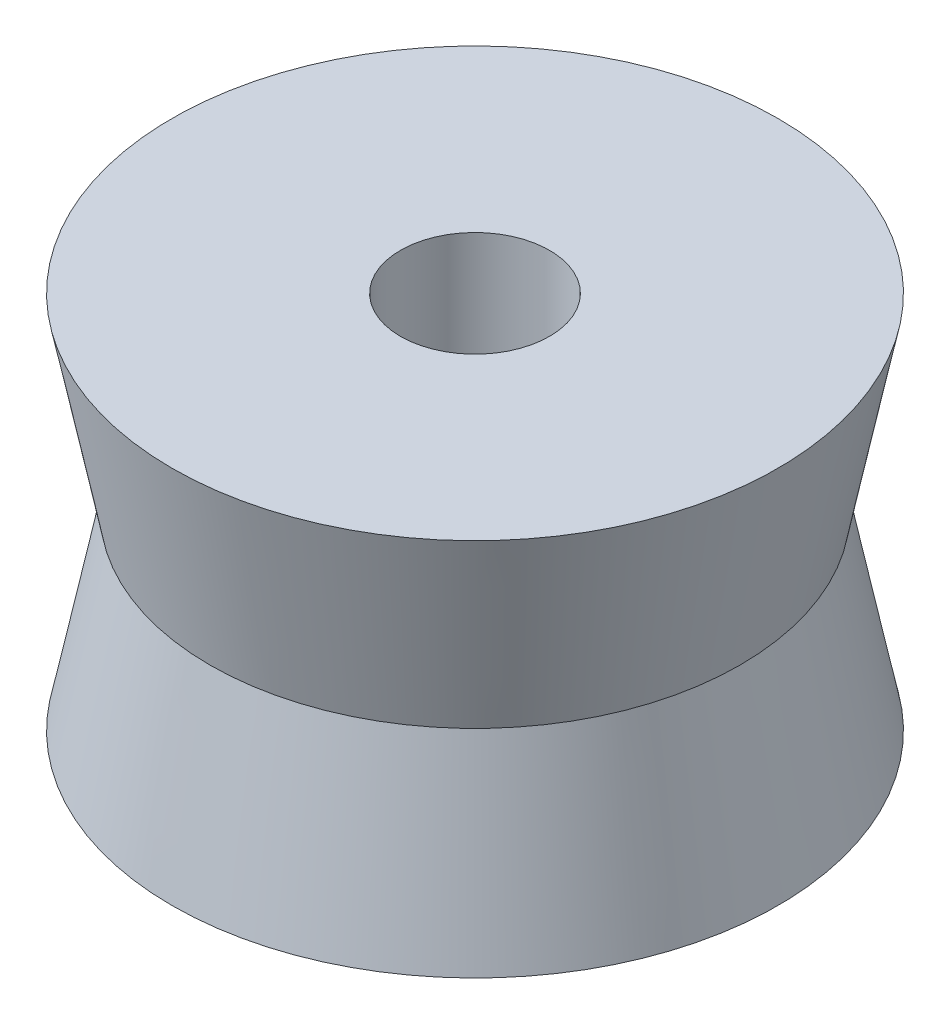
ISO-10303-21;
HEADER;
FILE_DESCRIPTION(('STEP AP214'),'2;1');
FILE_NAME('part.step','',(''),(''),'','','');
FILE_SCHEMA(('AUTOMOTIVE_DESIGN { 1 0 10303 214 1 1 1 1 }'));
ENDSEC;
DATA;
#1=APPLICATION_CONTEXT('core data for automotive mechanical design processes');
#2=APPLICATION_PROTOCOL_DEFINITION('international standard','automotive_design',2000,#1);
#3=PRODUCT_CONTEXT('',#1,'mechanical');
#4=PRODUCT('Part','Part','',(#3));
#5=PRODUCT_RELATED_PRODUCT_CATEGORY('part','',(#4));
#6=PRODUCT_DEFINITION_FORMATION('','',#4);
#7=PRODUCT_DEFINITION_CONTEXT('part definition',#1,'design');
#8=PRODUCT_DEFINITION('design','',#6,#7);
#9=PRODUCT_DEFINITION_SHAPE('','',#8);
#10=(LENGTH_UNIT() NAMED_UNIT(*) SI_UNIT(.MILLI.,.METRE.));
#11=(NAMED_UNIT(*) PLANE_ANGLE_UNIT() SI_UNIT($,.RADIAN.));
#12=(NAMED_UNIT(*) SI_UNIT($,.STERADIAN.) SOLID_ANGLE_UNIT());
#13=UNCERTAINTY_MEASURE_WITH_UNIT(LENGTH_MEASURE(1.E-05),#10,'distance_accuracy_value','');
#14=(GEOMETRIC_REPRESENTATION_CONTEXT(3) GLOBAL_UNCERTAINTY_ASSIGNED_CONTEXT((#13)) GLOBAL_UNIT_ASSIGNED_CONTEXT((#10,
#11,#12)) REPRESENTATION_CONTEXT('',''));
#15=CARTESIAN_POINT('',(0.,0.,0.));
#16=DIRECTION('',(0.,0.,1.));
#17=DIRECTION('',(1.,0.,0.));
#18=AXIS2_PLACEMENT_3D('',#15,#16,#17);
#19=CARTESIAN_POINT('',(0.,0.,0.));
#20=DIRECTION('',(0.,-1.,0.));
#21=DIRECTION('',(0.,0.,-1.));
#22=AXIS2_PLACEMENT_3D('',#19,#20,#21);
#23=CONICAL_SURFACE('',#22,10.16,0.197395559849881);
#24=CARTESIAN_POINT('',(0.,6.35,0.));
#25=DIRECTION('',(0.,1.,0.));
#26=DIRECTION('',(0.,0.,1.));
#27=AXIS2_PLACEMENT_3D('',#24,#25,#26);
#28=CIRCLE('',#27,8.89);
#29=CARTESIAN_POINT('',(0.,6.35,8.89));
#30=VERTEX_POINT('',#29);
#31=EDGE_CURVE('E52',#30,#30,#28,.T.);
#32=ORIENTED_EDGE('',*,*,#31,.F.);
#33=EDGE_LOOP('',(#32));
#34=FACE_BOUND('',#33,.T.);
#35=CARTESIAN_POINT('',(0.,0.,0.));
#36=DIRECTION('',(0.,1.,0.));
#37=DIRECTION('',(0.,0.,1.));
#38=AXIS2_PLACEMENT_3D('',#35,#36,#37);
#39=CIRCLE('',#38,10.16);
#40=CARTESIAN_POINT('',(0.,0.,10.16));
#41=VERTEX_POINT('',#40);
#42=EDGE_CURVE('E10',#41,#41,#39,.T.);
#43=ORIENTED_EDGE('',*,*,#42,.T.);
#44=EDGE_LOOP('',(#43));
#45=FACE_BOUND('',#44,.T.);
#46=ADVANCED_FACE('F33',(#34,#45),#23,.T.);
#47=CARTESIAN_POINT('',(0.,0.,0.));
#48=DIRECTION('',(0.,1.,0.));
#49=DIRECTION('',(0.,0.,1.));
#50=AXIS2_PLACEMENT_3D('',#47,#48,#49);
#51=PLANE('',#50);
#52=ORIENTED_EDGE('',*,*,#42,.F.);
#53=EDGE_LOOP('',(#52));
#54=FACE_BOUND('',#53,.T.);
#55=CARTESIAN_POINT('',(0.,0.,0.));
#56=DIRECTION('',(0.,1.,0.));
#57=DIRECTION('',(0.,0.,1.));
#58=AXIS2_PLACEMENT_3D('',#55,#56,#57);
#59=CIRCLE('',#58,2.5);
#60=CARTESIAN_POINT('',(0.,0.,2.5));
#61=VERTEX_POINT('',#60);
#62=EDGE_CURVE('E39',#61,#61,#59,.T.);
#63=ORIENTED_EDGE('',*,*,#62,.T.);
#64=EDGE_LOOP('',(#63));
#65=FACE_BOUND('',#64,.T.);
#66=ADVANCED_FACE('F59',(#54,#65),#51,.F.);
#67=CARTESIAN_POINT('',(0.,12.7,0.));
#68=DIRECTION('',(0.,1.,0.));
#69=DIRECTION('',(0.,0.,1.));
#70=AXIS2_PLACEMENT_3D('',#67,#68,#69);
#71=CYLINDRICAL_SURFACE('',#70,2.5);
#72=ORIENTED_EDGE('',*,*,#62,.F.);
#73=EDGE_LOOP('',(#72));
#74=FACE_BOUND('',#73,.T.);
#75=CARTESIAN_POINT('',(0.,12.7,0.));
#76=DIRECTION('',(0.,1.,0.));
#77=DIRECTION('',(0.,0.,1.));
#78=AXIS2_PLACEMENT_3D('',#75,#76,#77);
#79=CIRCLE('',#78,2.5);
#80=CARTESIAN_POINT('',(0.,12.7,2.5));
#81=VERTEX_POINT('',#80);
#82=EDGE_CURVE('E43',#81,#81,#79,.T.);
#83=ORIENTED_EDGE('',*,*,#82,.T.);
#84=EDGE_LOOP('',(#83));
#85=FACE_BOUND('',#84,.T.);
#86=ADVANCED_FACE('F63',(#74,#85),#71,.F.);
#87=CARTESIAN_POINT('',(0.,12.7,0.));
#88=DIRECTION('',(0.,1.,0.));
#89=DIRECTION('',(0.,0.,1.));
#90=AXIS2_PLACEMENT_3D('',#87,#88,#89);
#91=PLANE('',#90);
#92=CARTESIAN_POINT('',(0.,12.7,0.));
#93=DIRECTION('',(0.,1.,0.));
#94=DIRECTION('',(0.,0.,1.));
#95=AXIS2_PLACEMENT_3D('',#92,#93,#94);
#96=CIRCLE('',#95,10.16);
#97=CARTESIAN_POINT('',(0.,12.7,10.16));
#98=VERTEX_POINT('',#97);
#99=EDGE_CURVE('E47',#98,#98,#96,.T.);
#100=ORIENTED_EDGE('',*,*,#99,.T.);
#101=EDGE_LOOP('',(#100));
#102=FACE_BOUND('',#101,.T.);
#103=ORIENTED_EDGE('',*,*,#82,.F.);
#104=EDGE_LOOP('',(#103));
#105=FACE_BOUND('',#104,.T.);
#106=ADVANCED_FACE('F68',(#102,#105),#91,.T.);
#107=CARTESIAN_POINT('',(0.,6.35,0.));
#108=DIRECTION('',(0.,1.,0.));
#109=DIRECTION('',(0.,0.,1.));
#110=AXIS2_PLACEMENT_3D('',#107,#108,#109);
#111=CONICAL_SURFACE('',#110,8.89,0.197395559849881);
#112=ORIENTED_EDGE('',*,*,#99,.F.);
#113=EDGE_LOOP('',(#112));
#114=FACE_BOUND('',#113,.T.);
#115=ORIENTED_EDGE('',*,*,#31,.T.);
#116=EDGE_LOOP('',(#115));
#117=FACE_BOUND('',#116,.T.);
#118=ADVANCED_FACE('F56',(#114,#117),#111,.T.);
#119=CLOSED_SHELL('',(#46,#66,#86,#106,#118));
#120=MANIFOLD_SOLID_BREP('B2',#119);
#121=ADVANCED_BREP_SHAPE_REPRESENTATION('',(#18,#120),#14);
#122=SHAPE_DEFINITION_REPRESENTATION(#9,#121);
ENDSEC;
END-ISO-10303-21;
